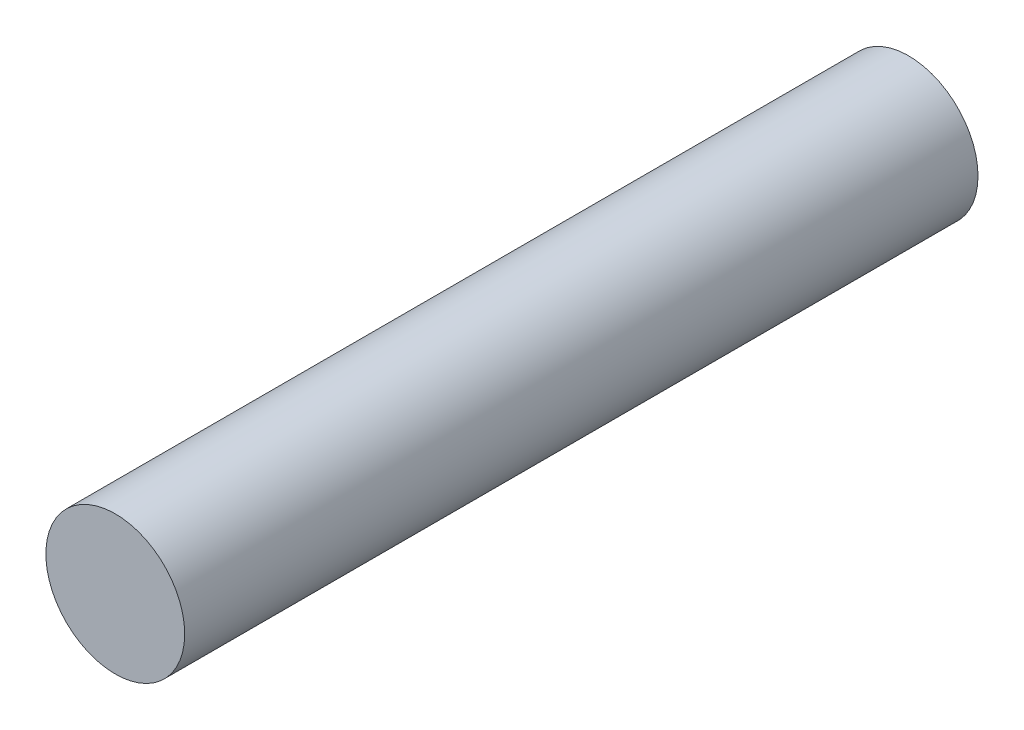
ISO-10303-21;
HEADER;
FILE_DESCRIPTION(('STEP AP214'),'2;1');
FILE_NAME('part.step','',(''),(''),'','','');
FILE_SCHEMA(('AUTOMOTIVE_DESIGN { 1 0 10303 214 1 1 1 1 }'));
ENDSEC;
DATA;
#1=APPLICATION_CONTEXT('core data for automotive mechanical design processes');
#2=APPLICATION_PROTOCOL_DEFINITION('international standard','automotive_design',2000,#1);
#3=PRODUCT_CONTEXT('',#1,'mechanical');
#4=PRODUCT('Part','Part','',(#3));
#5=PRODUCT_RELATED_PRODUCT_CATEGORY('part','',(#4));
#6=PRODUCT_DEFINITION_FORMATION('','',#4);
#7=PRODUCT_DEFINITION_CONTEXT('part definition',#1,'design');
#8=PRODUCT_DEFINITION('design','',#6,#7);
#9=PRODUCT_DEFINITION_SHAPE('','',#8);
#10=(LENGTH_UNIT() NAMED_UNIT(*) SI_UNIT(.MILLI.,.METRE.));
#11=(NAMED_UNIT(*) PLANE_ANGLE_UNIT() SI_UNIT($,.RADIAN.));
#12=(NAMED_UNIT(*) SI_UNIT($,.STERADIAN.) SOLID_ANGLE_UNIT());
#13=UNCERTAINTY_MEASURE_WITH_UNIT(LENGTH_MEASURE(1.E-05),#10,'distance_accuracy_value','');
#14=(GEOMETRIC_REPRESENTATION_CONTEXT(3) GLOBAL_UNCERTAINTY_ASSIGNED_CONTEXT((#13)) GLOBAL_UNIT_ASSIGNED_CONTEXT((#10,
#11,#12)) REPRESENTATION_CONTEXT('',''));
#15=CARTESIAN_POINT('',(0.,0.,0.));
#16=DIRECTION('',(0.,0.,1.));
#17=DIRECTION('',(1.,0.,0.));
#18=AXIS2_PLACEMENT_3D('',#15,#16,#17);
#19=CARTESIAN_POINT('',(0.,0.,120.));
#20=DIRECTION('',(0.,0.,-1.));
#21=DIRECTION('',(-1.,0.,0.));
#22=AXIS2_PLACEMENT_3D('',#19,#20,#21);
#23=CYLINDRICAL_SURFACE('',#22,10.5);
#24=CARTESIAN_POINT('',(0.,0.,120.));
#25=DIRECTION('',(0.,0.,1.));
#26=DIRECTION('',(1.,0.,0.));
#27=AXIS2_PLACEMENT_3D('',#24,#25,#26);
#28=CIRCLE('',#27,10.5);
#29=CARTESIAN_POINT('',(10.5,0.,120.));
#30=VERTEX_POINT('',#29);
#31=EDGE_CURVE('E10',#30,#30,#28,.T.);
#32=ORIENTED_EDGE('',*,*,#31,.F.);
#33=EDGE_LOOP('',(#32));
#34=FACE_BOUND('',#33,.T.);
#35=CARTESIAN_POINT('',(0.,0.,0.));
#36=DIRECTION('',(0.,0.,1.));
#37=DIRECTION('',(1.,0.,0.));
#38=AXIS2_PLACEMENT_3D('',#35,#36,#37);
#39=CIRCLE('',#38,10.5);
#40=CARTESIAN_POINT('',(10.5,0.,0.));
#41=VERTEX_POINT('',#40);
#42=EDGE_CURVE('E40',#41,#41,#39,.T.);
#43=ORIENTED_EDGE('',*,*,#42,.T.);
#44=EDGE_LOOP('',(#43));
#45=FACE_BOUND('',#44,.T.);
#46=ADVANCED_FACE('F37',(#34,#45),#23,.T.);
#47=CARTESIAN_POINT('',(0.,0.,120.));
#48=DIRECTION('',(0.,0.,1.));
#49=DIRECTION('',(1.,0.,0.));
#50=AXIS2_PLACEMENT_3D('',#47,#48,#49);
#51=PLANE('',#50);
#52=ORIENTED_EDGE('',*,*,#31,.T.);
#53=EDGE_LOOP('',(#52));
#54=FACE_BOUND('',#53,.T.);
#55=ADVANCED_FACE('F52',(#54),#51,.T.);
#56=CARTESIAN_POINT('',(0.,0.,0.));
#57=DIRECTION('',(0.,0.,1.));
#58=DIRECTION('',(1.,0.,0.));
#59=AXIS2_PLACEMENT_3D('',#56,#57,#58);
#60=PLANE('',#59);
#61=ORIENTED_EDGE('',*,*,#42,.F.);
#62=EDGE_LOOP('',(#61));
#63=FACE_BOUND('',#62,.T.);
#64=ADVANCED_FACE('F50',(#63),#60,.F.);
#65=CLOSED_SHELL('',(#46,#55,#64));
#66=MANIFOLD_SOLID_BREP('B2',#65);
#67=ADVANCED_BREP_SHAPE_REPRESENTATION('',(#18,#66),#14);
#68=SHAPE_DEFINITION_REPRESENTATION(#9,#67);
ENDSEC;
END-ISO-10303-21;
